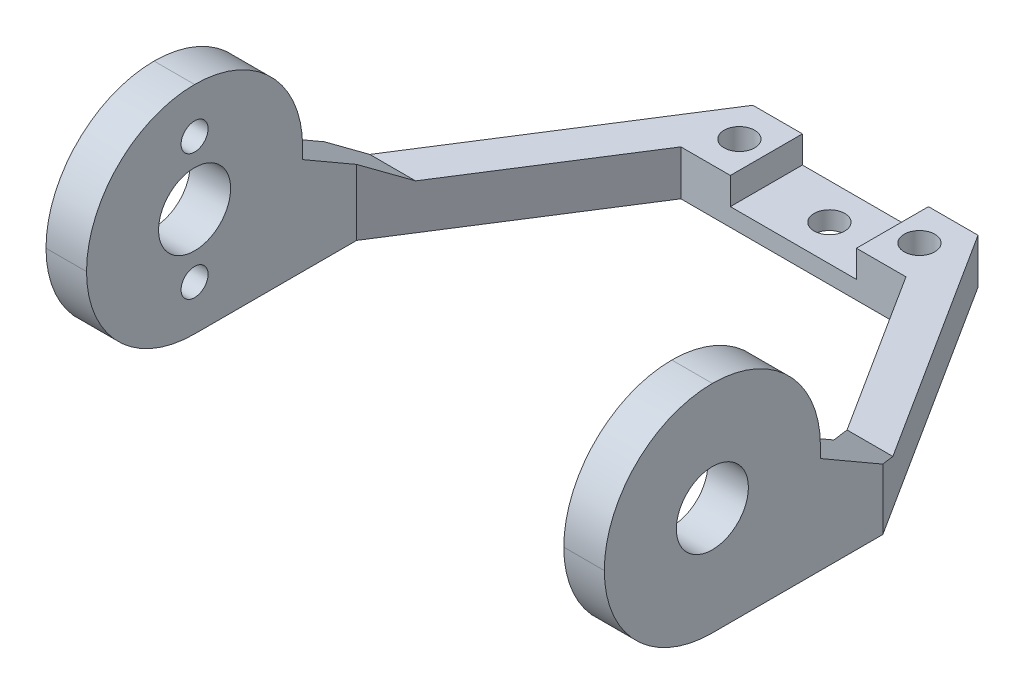
ISO-10303-21;
HEADER;
FILE_DESCRIPTION(('STEP AP214'),'2;1');
FILE_NAME('part.step','',(''),(''),'','','');
FILE_SCHEMA(('AUTOMOTIVE_DESIGN { 1 0 10303 214 1 1 1 1 }'));
ENDSEC;
DATA;
#1=APPLICATION_CONTEXT('core data for automotive mechanical design processes');
#2=APPLICATION_PROTOCOL_DEFINITION('international standard','automotive_design',2000,#1);
#3=PRODUCT_CONTEXT('',#1,'mechanical');
#4=PRODUCT('Part','Part','',(#3));
#5=PRODUCT_RELATED_PRODUCT_CATEGORY('part','',(#4));
#6=PRODUCT_DEFINITION_FORMATION('','',#4);
#7=PRODUCT_DEFINITION_CONTEXT('part definition',#1,'design');
#8=PRODUCT_DEFINITION('design','',#6,#7);
#9=PRODUCT_DEFINITION_SHAPE('','',#8);
#10=(LENGTH_UNIT() NAMED_UNIT(*) SI_UNIT(.MILLI.,.METRE.));
#11=(NAMED_UNIT(*) PLANE_ANGLE_UNIT() SI_UNIT($,.RADIAN.));
#12=(NAMED_UNIT(*) SI_UNIT($,.STERADIAN.) SOLID_ANGLE_UNIT());
#13=UNCERTAINTY_MEASURE_WITH_UNIT(LENGTH_MEASURE(1.E-05),#10,'distance_accuracy_value','');
#14=(GEOMETRIC_REPRESENTATION_CONTEXT(3) GLOBAL_UNCERTAINTY_ASSIGNED_CONTEXT((#13)) GLOBAL_UNIT_ASSIGNED_CONTEXT((#10,
#11,#12)) REPRESENTATION_CONTEXT('',''));
#15=CARTESIAN_POINT('',(0.,0.,0.));
#16=DIRECTION('',(0.,0.,1.));
#17=DIRECTION('',(1.,0.,0.));
#18=AXIS2_PLACEMENT_3D('',#15,#16,#17);
#19=CARTESIAN_POINT('',(0.,5.,0.));
#20=DIRECTION('',(0.,-1.,0.));
#21=DIRECTION('',(0.,0.,-1.));
#22=AXIS2_PLACEMENT_3D('',#19,#20,#21);
#23=PLANE('',#22);
#24=DIRECTION('',(0.536875492193159,0.,0.843661487732107));
#25=VECTOR('',#24,1.);
#26=CARTESIAN_POINT('',(12.5,5.,-37.));
#27=LINE('',#26,#25);
#28=CARTESIAN_POINT('',(12.5,5.,-37.));
#29=VERTEX_POINT('',#28);
#30=CARTESIAN_POINT('',(23.9545454545455,5.,-18.9999999999999));
#31=VERTEX_POINT('',#30);
#32=EDGE_CURVE('E227',#29,#31,#27,.T.);
#33=ORIENTED_EDGE('',*,*,#32,.T.);
#34=DIRECTION('',(1.,0.,0.));
#35=VECTOR('',#34,1.);
#36=CARTESIAN_POINT('',(31.,5.,-18.9999999999999));
#37=LINE('',#36,#35);
#38=CARTESIAN_POINT('',(29.0454545454546,5.,-18.9999999999999));
#39=VERTEX_POINT('',#38);
#40=EDGE_CURVE('E342',#31,#39,#37,.T.);
#41=ORIENTED_EDGE('',*,*,#40,.T.);
#42=DIRECTION('',(-0.536875492193159,0.,-0.843661487732108));
#43=VECTOR('',#42,1.);
#44=CARTESIAN_POINT('',(12.5,5.,-45.));
#45=LINE('',#44,#43);
#46=CARTESIAN_POINT('',(12.5,5.,-45.));
#47=VERTEX_POINT('',#46);
#48=EDGE_CURVE('E224',#39,#47,#45,.T.);
#49=ORIENTED_EDGE('',*,*,#48,.T.);
#50=DIRECTION('',(-1.,0.,0.));
#51=VECTOR('',#50,1.);
#52=CARTESIAN_POINT('',(-12.5,5.,-45.));
#53=LINE('',#52,#51);
#54=CARTESIAN_POINT('',(7.,5.,-45.));
#55=VERTEX_POINT('',#54);
#56=EDGE_CURVE('E223',#47,#55,#53,.T.);
#57=ORIENTED_EDGE('',*,*,#56,.T.);
#58=DIRECTION('',(0.,0.,-1.));
#59=VECTOR('',#58,1.);
#60=CARTESIAN_POINT('',(7.,5.,-22.6821789367236));
#61=LINE('',#60,#59);
#62=CARTESIAN_POINT('',(7.,5.,-37.));
#63=VERTEX_POINT('',#62);
#64=EDGE_CURVE('E216',#63,#55,#61,.T.);
#65=ORIENTED_EDGE('',*,*,#64,.F.);
#66=DIRECTION('',(1.,0.,0.));
#67=VECTOR('',#66,1.);
#68=CARTESIAN_POINT('',(-12.5,5.,-37.));
#69=LINE('',#68,#67);
#70=EDGE_CURVE('E384',#63,#29,#69,.T.);
#71=ORIENTED_EDGE('',*,*,#70,.T.);
#72=EDGE_LOOP('',(#33,#41,#49,#57,#65,#71));
#73=FACE_BOUND('',#72,.T.);
#74=CARTESIAN_POINT('',(10.,5.,-41.));
#75=DIRECTION('',(0.,-1.,0.));
#76=DIRECTION('',(0.,0.,1.));
#77=AXIS2_PLACEMENT_3D('',#74,#75,#76);
#78=CIRCLE('',#77,1.7);
#79=CARTESIAN_POINT('',(10.,5.,-39.3));
#80=VERTEX_POINT('',#79);
#81=EDGE_CURVE('E831',#80,#80,#78,.T.);
#82=ORIENTED_EDGE('',*,*,#81,.T.);
#83=EDGE_LOOP('',(#82));
#84=FACE_BOUND('',#83,.T.);
#85=ADVANCED_FACE('F35',(#73,#84),#23,.F.);
#86=CARTESIAN_POINT('',(0.,0.,0.));
#87=DIRECTION('',(0.,-1.,0.));
#88=DIRECTION('',(0.,0.,-1.));
#89=AXIS2_PLACEMENT_3D('',#86,#87,#88);
#90=PLANE('',#89);
#91=DIRECTION('',(0.,0.,-1.));
#92=VECTOR('',#91,1.);
#93=CARTESIAN_POINT('',(31.,0.,15.));
#94=LINE('',#93,#92);
#95=CARTESIAN_POINT('',(31.,0.,3.));
#96=VERTEX_POINT('',#95);
#97=CARTESIAN_POINT('',(31.,0.,-15.9285714285714));
#98=VERTEX_POINT('',#97);
#99=EDGE_CURVE('E249',#96,#98,#94,.T.);
#100=ORIENTED_EDGE('',*,*,#99,.F.);
#101=DIRECTION('',(1.,0.,0.));
#102=VECTOR('',#101,1.);
#103=CARTESIAN_POINT('',(26.5,0.,3.));
#104=LINE('',#103,#102);
#105=CARTESIAN_POINT('',(26.5,0.,3.));
#106=VERTEX_POINT('',#105);
#107=EDGE_CURVE('E318',#96,#106,#104,.F.);
#108=ORIENTED_EDGE('',*,*,#107,.T.);
#109=DIRECTION('',(0.,0.,1.));
#110=VECTOR('',#109,1.);
#111=CARTESIAN_POINT('',(26.5,0.,15.));
#112=LINE('',#111,#110);
#113=CARTESIAN_POINT('',(26.5,0.,-15.));
#114=VERTEX_POINT('',#113);
#115=EDGE_CURVE('E246',#114,#106,#112,.T.);
#116=ORIENTED_EDGE('',*,*,#115,.F.);
#117=DIRECTION('',(0.536875492193159,0.,0.843661487732107));
#118=VECTOR('',#117,1.);
#119=CARTESIAN_POINT('',(12.5,0.,-37.));
#120=LINE('',#119,#118);
#121=CARTESIAN_POINT('',(12.5,0.,-37.));
#122=VERTEX_POINT('',#121);
#123=EDGE_CURVE('E244',#122,#114,#120,.T.);
#124=ORIENTED_EDGE('',*,*,#123,.F.);
#125=DIRECTION('',(1.,0.,0.));
#126=VECTOR('',#125,1.);
#127=CARTESIAN_POINT('',(-12.5,0.,-37.));
#128=LINE('',#127,#126);
#129=CARTESIAN_POINT('',(-12.5,0.,-37.));
#130=VERTEX_POINT('',#129);
#131=EDGE_CURVE('E242',#130,#122,#128,.T.);
#132=ORIENTED_EDGE('',*,*,#131,.F.);
#133=DIRECTION('',(0.536875492193159,0.,-0.843661487732108));
#134=VECTOR('',#133,1.);
#135=CARTESIAN_POINT('',(-26.5,0.,-15.));
#136=LINE('',#135,#134);
#137=CARTESIAN_POINT('',(-26.5,0.,-15.));
#138=VERTEX_POINT('',#137);
#139=EDGE_CURVE('E240',#138,#130,#136,.T.);
#140=ORIENTED_EDGE('',*,*,#139,.F.);
#141=DIRECTION('',(0.,0.,-1.));
#142=VECTOR('',#141,1.);
#143=CARTESIAN_POINT('',(-26.5,0.,15.));
#144=LINE('',#143,#142);
#145=CARTESIAN_POINT('',(-26.5,0.,3.));
#146=VERTEX_POINT('',#145);
#147=EDGE_CURVE('E238',#146,#138,#144,.T.);
#148=ORIENTED_EDGE('',*,*,#147,.F.);
#149=DIRECTION('',(1.,0.,0.));
#150=VECTOR('',#149,1.);
#151=CARTESIAN_POINT('',(-31.,0.,3.));
#152=LINE('',#151,#150);
#153=CARTESIAN_POINT('',(-31.,0.,3.));
#154=VERTEX_POINT('',#153);
#155=EDGE_CURVE('E316',#146,#154,#152,.F.);
#156=ORIENTED_EDGE('',*,*,#155,.T.);
#157=DIRECTION('',(0.,0.,1.));
#158=VECTOR('',#157,1.);
#159=CARTESIAN_POINT('',(-31.,0.,-15.9285714285714));
#160=LINE('',#159,#158);
#161=CARTESIAN_POINT('',(-31.,0.,-15.9285714285714));
#162=VERTEX_POINT('',#161);
#163=EDGE_CURVE('E234',#162,#154,#160,.T.);
#164=ORIENTED_EDGE('',*,*,#163,.F.);
#165=DIRECTION('',(-0.536875492193159,0.,0.843661487732108));
#166=VECTOR('',#165,1.);
#167=CARTESIAN_POINT('',(-31.,0.,-15.9285714285714));
#168=LINE('',#167,#166);
#169=CARTESIAN_POINT('',(-12.5,0.,-45.));
#170=VERTEX_POINT('',#169);
#171=EDGE_CURVE('E231',#170,#162,#168,.T.);
#172=ORIENTED_EDGE('',*,*,#171,.F.);
#173=DIRECTION('',(-1.,0.,0.));
#174=VECTOR('',#173,1.);
#175=CARTESIAN_POINT('',(-12.5,0.,-45.));
#176=LINE('',#175,#174);
#177=CARTESIAN_POINT('',(12.5,0.,-45.));
#178=VERTEX_POINT('',#177);
#179=EDGE_CURVE('E253',#178,#170,#176,.T.);
#180=ORIENTED_EDGE('',*,*,#179,.F.);
#181=DIRECTION('',(-0.536875492193159,0.,-0.843661487732108));
#182=VECTOR('',#181,1.);
#183=CARTESIAN_POINT('',(12.5,0.,-45.));
#184=LINE('',#183,#182);
#185=EDGE_CURVE('E251',#98,#178,#184,.T.);
#186=ORIENTED_EDGE('',*,*,#185,.F.);
#187=EDGE_LOOP('',(#100,#108,#116,#124,#132,#140,#148,#156,#164,#172,#180,#186));
#188=FACE_BOUND('',#187,.T.);
#189=CARTESIAN_POINT('',(0.,0.,-41.));
#190=DIRECTION('',(0.,-1.,0.));
#191=DIRECTION('',(0.,0.,-1.));
#192=AXIS2_PLACEMENT_3D('',#189,#190,#191);
#193=CIRCLE('',#192,1.7);
#194=CARTESIAN_POINT('',(0.,0.,-42.7));
#195=VERTEX_POINT('',#194);
#196=EDGE_CURVE('E377',#195,#195,#193,.F.);
#197=ORIENTED_EDGE('',*,*,#196,.T.);
#198=EDGE_LOOP('',(#197));
#199=FACE_BOUND('',#198,.T.);
#200=CARTESIAN_POINT('',(-10.,0.,-41.));
#201=DIRECTION('',(0.,-1.,0.));
#202=DIRECTION('',(0.,0.,-1.));
#203=AXIS2_PLACEMENT_3D('',#200,#201,#202);
#204=CIRCLE('',#203,1.7);
#205=CARTESIAN_POINT('',(-10.,0.,-42.7));
#206=VERTEX_POINT('',#205);
#207=EDGE_CURVE('E429',#206,#206,#204,.F.);
#208=ORIENTED_EDGE('',*,*,#207,.T.);
#209=EDGE_LOOP('',(#208));
#210=FACE_BOUND('',#209,.T.);
#211=CARTESIAN_POINT('',(10.,0.,-41.));
#212=DIRECTION('',(0.,-1.,0.));
#213=DIRECTION('',(0.,0.,-1.));
#214=AXIS2_PLACEMENT_3D('',#211,#212,#213);
#215=CIRCLE('',#214,1.7);
#216=CARTESIAN_POINT('',(10.,0.,-42.7));
#217=VERTEX_POINT('',#216);
#218=EDGE_CURVE('E432',#217,#217,#215,.T.);
#219=ORIENTED_EDGE('',*,*,#218,.F.);
#220=EDGE_LOOP('',(#219));
#221=FACE_BOUND('',#220,.T.);
#222=ADVANCED_FACE('F409',(#188,#199,#210,#221),#90,.T.);
#223=CARTESIAN_POINT('',(-10.,5.,-41.));
#224=DIRECTION('',(0.,1.,0.));
#225=DIRECTION('',(0.,0.,1.));
#226=AXIS2_PLACEMENT_3D('',#223,#224,#225);
#227=CIRCLE('',#226,1.7);
#228=CARTESIAN_POINT('',(-10.,5.,-39.3));
#229=VERTEX_POINT('',#228);
#230=EDGE_CURVE('E332',#229,#229,#227,.T.);
#231=ORIENTED_EDGE('',*,*,#230,.F.);
#232=EDGE_LOOP('',(#231));
#233=FACE_BOUND('',#232,.T.);
#234=DIRECTION('',(-0.536875492193159,0.,0.843661487732108));
#235=VECTOR('',#234,1.);
#236=CARTESIAN_POINT('',(-31.,5.,-15.9285714285714));
#237=LINE('',#236,#235);
#238=CARTESIAN_POINT('',(-12.5,5.,-45.));
#239=VERTEX_POINT('',#238);
#240=CARTESIAN_POINT('',(-29.0454545454546,5.,-18.9999999999999));
#241=VERTEX_POINT('',#240);
#242=EDGE_CURVE('E255',#239,#241,#237,.T.);
#243=ORIENTED_EDGE('',*,*,#242,.T.);
#244=DIRECTION('',(1.,0.,0.));
#245=VECTOR('',#244,1.);
#246=CARTESIAN_POINT('',(-26.5,5.,-18.9999999999999));
#247=LINE('',#246,#245);
#248=CARTESIAN_POINT('',(-23.9545454545455,5.,-18.9999999999999));
#249=VERTEX_POINT('',#248);
#250=EDGE_CURVE('E337',#241,#249,#247,.T.);
#251=ORIENTED_EDGE('',*,*,#250,.T.);
#252=DIRECTION('',(0.536875492193159,0.,-0.843661487732108));
#253=VECTOR('',#252,1.);
#254=CARTESIAN_POINT('',(-26.5,5.,-15.));
#255=LINE('',#254,#253);
#256=CARTESIAN_POINT('',(-12.5,5.,-37.));
#257=VERTEX_POINT('',#256);
#258=EDGE_CURVE('E382',#249,#257,#255,.T.);
#259=ORIENTED_EDGE('',*,*,#258,.T.);
#260=CARTESIAN_POINT('',(-7.,5.,-37.));
#261=VERTEX_POINT('',#260);
#262=EDGE_CURVE('E215',#257,#261,#69,.T.);
#263=ORIENTED_EDGE('',*,*,#262,.T.);
#264=DIRECTION('',(0.,0.,-1.));
#265=VECTOR('',#264,1.);
#266=CARTESIAN_POINT('',(-7.,5.,-22.6821789367236));
#267=LINE('',#266,#265);
#268=CARTESIAN_POINT('',(-7.,5.,-45.));
#269=VERTEX_POINT('',#268);
#270=EDGE_CURVE('E197',#261,#269,#267,.T.);
#271=ORIENTED_EDGE('',*,*,#270,.T.);
#272=EDGE_CURVE('E212',#269,#239,#53,.T.);
#273=ORIENTED_EDGE('',*,*,#272,.T.);
#274=EDGE_LOOP('',(#243,#251,#259,#263,#271,#273));
#275=FACE_BOUND('',#274,.T.);
#276=ADVANCED_FACE('F211',(#233,#275),#23,.F.);
#277=CARTESIAN_POINT('',(-31.,5.,-15.9285714285714));
#278=DIRECTION('',(0.843661487732108,0.,0.536875492193159));
#279=DIRECTION('',(0.536875492193159,0.,-0.843661487732108));
#280=AXIS2_PLACEMENT_3D('',#277,#278,#279);
#281=PLANE('',#280);
#282=ORIENTED_EDGE('',*,*,#171,.T.);
#283=DIRECTION('',(0.,-1.,0.));
#284=VECTOR('',#283,1.);
#285=CARTESIAN_POINT('',(-31.,5.,-15.9285714285714));
#286=LINE('',#285,#284);
#287=CARTESIAN_POINT('',(-31.,6.77329011251099,-15.9285714285714));
#288=VERTEX_POINT('',#287);
#289=EDGE_CURVE('E271',#288,#162,#286,.T.);
#290=ORIENTED_EDGE('',*,*,#289,.F.);
#291=DIRECTION('',(-0.482662977574166,0.437903085761922,0.758470393330832));
#292=VECTOR('',#291,1.);
#293=CARTESIAN_POINT('',(-30.6251980982567,6.43324557429572,-16.5175458455965));
#294=LINE('',#293,#292);
#295=EDGE_CURVE('E347',#288,#241,#294,.F.);
#296=ORIENTED_EDGE('',*,*,#295,.T.);
#297=ORIENTED_EDGE('',*,*,#242,.F.);
#298=DIRECTION('',(0.,-1.,0.));
#299=VECTOR('',#298,1.);
#300=CARTESIAN_POINT('',(-12.5,5.,-45.));
#301=LINE('',#300,#299);
#302=EDGE_CURVE('E221',#239,#170,#301,.T.);
#303=ORIENTED_EDGE('',*,*,#302,.T.);
#304=EDGE_LOOP('',(#282,#290,#296,#297,#303));
#305=FACE_BOUND('',#304,.T.);
#306=ADVANCED_FACE('F418',(#305),#281,.F.);
#307=CARTESIAN_POINT('',(-31.,5.,-15.9285714285714));
#308=DIRECTION('',(1.,0.,0.));
#309=DIRECTION('',(0.,0.,-1.));
#310=AXIS2_PLACEMENT_3D('',#307,#308,#309);
#311=PLANE('',#310);
#312=CARTESIAN_POINT('',(-31.,12.,2.99999999999981));
#313=DIRECTION('',(1.,0.,0.));
#314=DIRECTION('',(0.,0.,-1.));
#315=AXIS2_PLACEMENT_3D('',#312,#313,#314);
#316=CIRCLE('',#315,4.);
#317=CARTESIAN_POINT('',(-31.,12.,-1.00000000000019));
#318=VERTEX_POINT('',#317);
#319=EDGE_CURVE('E445',#318,#318,#316,.T.);
#320=ORIENTED_EDGE('',*,*,#319,.T.);
#321=EDGE_LOOP('',(#320));
#322=FACE_BOUND('',#321,.T.);
#323=CARTESIAN_POINT('',(-31.,5.,2.99999999999961));
#324=DIRECTION('',(1.,0.,0.));
#325=DIRECTION('',(0.,0.,-1.));
#326=AXIS2_PLACEMENT_3D('',#323,#324,#325);
#327=CIRCLE('',#326,1.50000000000043);
#328=CARTESIAN_POINT('',(-31.,5.,1.49999999999918));
#329=VERTEX_POINT('',#328);
#330=EDGE_CURVE('E451',#329,#329,#327,.F.);
#331=ORIENTED_EDGE('',*,*,#330,.F.);
#332=EDGE_LOOP('',(#331));
#333=FACE_BOUND('',#332,.T.);
#334=CARTESIAN_POINT('',(-31.,19.,3.00000000000001));
#335=DIRECTION('',(1.,0.,0.));
#336=DIRECTION('',(0.,0.,-1.));
#337=AXIS2_PLACEMENT_3D('',#334,#335,#336);
#338=CIRCLE('',#337,1.5);
#339=CARTESIAN_POINT('',(-31.,19.,1.50000000000001));
#340=VERTEX_POINT('',#339);
#341=EDGE_CURVE('E206',#340,#340,#338,.F.);
#342=ORIENTED_EDGE('',*,*,#341,.F.);
#343=EDGE_LOOP('',(#342));
#344=FACE_BOUND('',#343,.T.);
#345=CARTESIAN_POINT('',(-31.,12.,3.));
#346=DIRECTION('',(1.,0.,0.));
#347=DIRECTION('',(0.,0.,-1.));
#348=AXIS2_PLACEMENT_3D('',#345,#346,#347);
#349=CIRCLE('',#348,12.);
#350=CARTESIAN_POINT('',(-31.,12.,15.));
#351=VERTEX_POINT('',#350);
#352=CARTESIAN_POINT('',(-31.,24.,3.));
#353=VERTEX_POINT('',#352);
#354=EDGE_CURVE('E286',#351,#353,#349,.F.);
#355=ORIENTED_EDGE('',*,*,#354,.T.);
#356=CARTESIAN_POINT('',(-31.,12.,3.));
#357=DIRECTION('',(1.,0.,0.));
#358=DIRECTION('',(0.,0.,-1.));
#359=AXIS2_PLACEMENT_3D('',#356,#357,#358);
#360=CIRCLE('',#359,12.);
#361=CARTESIAN_POINT('',(-31.,12.,-9.));
#362=VERTEX_POINT('',#361);
#363=EDGE_CURVE('E288',#353,#362,#360,.F.);
#364=ORIENTED_EDGE('',*,*,#363,.T.);
#365=DIRECTION('',(0.,-1.,0.));
#366=VECTOR('',#365,1.);
#367=CARTESIAN_POINT('',(-31.,24.,-9.));
#368=LINE('',#367,#366);
#369=CARTESIAN_POINT('',(-31.,10.7735026918963,-9.));
#370=VERTEX_POINT('',#369);
#371=EDGE_CURVE('E280',#362,#370,#368,.T.);
#372=ORIENTED_EDGE('',*,*,#371,.T.);
#373=DIRECTION('',(0.,0.500000000000005,0.866025403784436));
#374=VECTOR('',#373,1.);
#375=CARTESIAN_POINT('',(-31.,6.32996758438323,-16.6964285714286));
#376=LINE('',#375,#374);
#377=EDGE_CURVE('E344',#370,#288,#376,.F.);
#378=ORIENTED_EDGE('',*,*,#377,.T.);
#379=ORIENTED_EDGE('',*,*,#289,.T.);
#380=ORIENTED_EDGE('',*,*,#163,.T.);
#381=CARTESIAN_POINT('',(-31.,12.,3.));
#382=DIRECTION('',(1.,0.,0.));
#383=DIRECTION('',(0.,0.,-1.));
#384=AXIS2_PLACEMENT_3D('',#381,#382,#383);
#385=CIRCLE('',#384,12.);
#386=EDGE_CURVE('E274',#154,#351,#385,.F.);
#387=ORIENTED_EDGE('',*,*,#386,.T.);
#388=EDGE_LOOP('',(#355,#364,#372,#378,#379,#380,#387));
#389=FACE_BOUND('',#388,.T.);
#390=ADVANCED_FACE('F423',(#322,#333,#344,#389),#311,.F.);
#391=CARTESIAN_POINT('',(-26.5,5.,15.));
#392=DIRECTION('',(-1.,0.,0.));
#393=DIRECTION('',(0.,0.,1.));
#394=AXIS2_PLACEMENT_3D('',#391,#392,#393);
#395=PLANE('',#394);
#396=CARTESIAN_POINT('',(-26.5,12.,2.99999999999981));
#397=DIRECTION('',(-1.,0.,0.));
#398=DIRECTION('',(0.,0.,1.));
#399=AXIS2_PLACEMENT_3D('',#396,#397,#398);
#400=CIRCLE('',#399,4.);
#401=CARTESIAN_POINT('',(-26.5,12.,6.99999999999981));
#402=VERTEX_POINT('',#401);
#403=EDGE_CURVE('E442',#402,#402,#400,.T.);
#404=ORIENTED_EDGE('',*,*,#403,.T.);
#405=EDGE_LOOP('',(#404));
#406=FACE_BOUND('',#405,.T.);
#407=CARTESIAN_POINT('',(-26.5,5.,2.99999999999961));
#408=DIRECTION('',(1.,0.,0.));
#409=DIRECTION('',(0.,0.,-1.));
#410=AXIS2_PLACEMENT_3D('',#407,#408,#409);
#411=CIRCLE('',#410,1.50000000000043);
#412=CARTESIAN_POINT('',(-26.5,5.,1.49999999999918));
#413=VERTEX_POINT('',#412);
#414=EDGE_CURVE('E448',#413,#413,#411,.T.);
#415=ORIENTED_EDGE('',*,*,#414,.F.);
#416=EDGE_LOOP('',(#415));
#417=FACE_BOUND('',#416,.T.);
#418=CARTESIAN_POINT('',(-26.5,19.,3.00000000000001));
#419=DIRECTION('',(1.,0.,0.));
#420=DIRECTION('',(0.,0.,-1.));
#421=AXIS2_PLACEMENT_3D('',#418,#419,#420);
#422=CIRCLE('',#421,1.5);
#423=CARTESIAN_POINT('',(-26.5,19.,1.50000000000001));
#424=VERTEX_POINT('',#423);
#425=EDGE_CURVE('E454',#424,#424,#422,.T.);
#426=ORIENTED_EDGE('',*,*,#425,.F.);
#427=EDGE_LOOP('',(#426));
#428=FACE_BOUND('',#427,.T.);
#429=DIRECTION('',(0.,-1.,0.));
#430=VECTOR('',#429,1.);
#431=CARTESIAN_POINT('',(-26.5,24.,-9.));
#432=LINE('',#431,#430);
#433=CARTESIAN_POINT('',(-26.5,12.,-9.));
#434=VERTEX_POINT('',#433);
#435=CARTESIAN_POINT('',(-26.5,10.7735026918963,-9.));
#436=VERTEX_POINT('',#435);
#437=EDGE_CURVE('E235',#434,#436,#432,.T.);
#438=ORIENTED_EDGE('',*,*,#437,.F.);
#439=CARTESIAN_POINT('',(-26.5,12.,3.));
#440=DIRECTION('',(-1.,0.,0.));
#441=DIRECTION('',(0.,0.,1.));
#442=AXIS2_PLACEMENT_3D('',#439,#440,#441);
#443=CIRCLE('',#442,12.);
#444=CARTESIAN_POINT('',(-26.5,24.,3.));
#445=VERTEX_POINT('',#444);
#446=EDGE_CURVE('E299',#434,#445,#443,.F.);
#447=ORIENTED_EDGE('',*,*,#446,.T.);
#448=CARTESIAN_POINT('',(-26.5,12.,3.));
#449=DIRECTION('',(-1.,0.,0.));
#450=DIRECTION('',(0.,0.,1.));
#451=AXIS2_PLACEMENT_3D('',#448,#449,#450);
#452=CIRCLE('',#451,12.);
#453=CARTESIAN_POINT('',(-26.5,12.,15.));
#454=VERTEX_POINT('',#453);
#455=EDGE_CURVE('E297',#445,#454,#452,.F.);
#456=ORIENTED_EDGE('',*,*,#455,.T.);
#457=CARTESIAN_POINT('',(-26.5,12.,3.));
#458=DIRECTION('',(-1.,0.,0.));
#459=DIRECTION('',(0.,0.,1.));
#460=AXIS2_PLACEMENT_3D('',#457,#458,#459);
#461=CIRCLE('',#460,12.);
#462=EDGE_CURVE('E295',#454,#146,#461,.F.);
#463=ORIENTED_EDGE('',*,*,#462,.T.);
#464=ORIENTED_EDGE('',*,*,#147,.T.);
#465=DIRECTION('',(0.,-1.,0.));
#466=VECTOR('',#465,1.);
#467=CARTESIAN_POINT('',(-26.5,5.,-15.));
#468=LINE('',#467,#466);
#469=CARTESIAN_POINT('',(-26.5,7.3094010767585,-15.));
#470=VERTEX_POINT('',#469);
#471=EDGE_CURVE('E268',#470,#138,#468,.T.);
#472=ORIENTED_EDGE('',*,*,#471,.F.);
#473=DIRECTION('',(0.,-0.500000000000005,-0.866025403784436));
#474=VECTOR('',#473,1.);
#475=CARTESIAN_POINT('',(-26.5,19.7224318643355,6.49999999999987));
#476=LINE('',#475,#474);
#477=EDGE_CURVE('E352',#470,#436,#476,.F.);
#478=ORIENTED_EDGE('',*,*,#477,.T.);
#479=EDGE_LOOP('',(#438,#447,#456,#463,#464,#472,#478));
#480=FACE_BOUND('',#479,.T.);
#481=ADVANCED_FACE('F523',(#406,#417,#428,#480),#395,.F.);
#482=CARTESIAN_POINT('',(-26.5,5.,-15.));
#483=DIRECTION('',(-0.843661487732108,0.,-0.536875492193159));
#484=DIRECTION('',(-0.536875492193159,0.,0.843661487732108));
#485=AXIS2_PLACEMENT_3D('',#482,#483,#484);
#486=PLANE('',#485);
#487=ORIENTED_EDGE('',*,*,#139,.T.);
#488=DIRECTION('',(0.,-1.,0.));
#489=VECTOR('',#488,1.);
#490=CARTESIAN_POINT('',(-12.5,5.,-37.));
#491=LINE('',#490,#489);
#492=EDGE_CURVE('E265',#257,#130,#491,.T.);
#493=ORIENTED_EDGE('',*,*,#492,.F.);
#494=ORIENTED_EDGE('',*,*,#258,.F.);
#495=DIRECTION('',(0.482662977574166,-0.437903085761922,-0.758470393330832));
#496=VECTOR('',#495,1.);
#497=CARTESIAN_POINT('',(-26.0118858954041,6.86655237582699,-15.7670364500792));
#498=LINE('',#497,#496);
#499=EDGE_CURVE('E349',#249,#470,#498,.F.);
#500=ORIENTED_EDGE('',*,*,#499,.T.);
#501=ORIENTED_EDGE('',*,*,#471,.T.);
#502=EDGE_LOOP('',(#487,#493,#494,#500,#501));
#503=FACE_BOUND('',#502,.T.);
#504=ADVANCED_FACE('F405',(#503),#486,.F.);
#505=CARTESIAN_POINT('',(-12.5,5.,-37.));
#506=DIRECTION('',(0.,0.,-1.));
#507=DIRECTION('',(-1.,0.,0.));
#508=AXIS2_PLACEMENT_3D('',#505,#506,#507);
#509=PLANE('',#508);
#510=DIRECTION('',(1.,0.,0.));
#511=VECTOR('',#510,1.);
#512=CARTESIAN_POINT('',(7.,2.,-37.));
#513=LINE('',#512,#511);
#514=CARTESIAN_POINT('',(-7.,2.,-37.));
#515=VERTEX_POINT('',#514);
#516=CARTESIAN_POINT('',(7.,2.,-37.));
#517=VERTEX_POINT('',#516);
#518=EDGE_CURVE('E461',#515,#517,#513,.T.);
#519=ORIENTED_EDGE('',*,*,#518,.F.);
#520=DIRECTION('',(0.,-1.,0.));
#521=VECTOR('',#520,1.);
#522=CARTESIAN_POINT('',(-7.,2.,-37.));
#523=LINE('',#522,#521);
#524=EDGE_CURVE('E463',#261,#515,#523,.T.);
#525=ORIENTED_EDGE('',*,*,#524,.F.);
#526=ORIENTED_EDGE('',*,*,#262,.F.);
#527=ORIENTED_EDGE('',*,*,#492,.T.);
#528=ORIENTED_EDGE('',*,*,#131,.T.);
#529=DIRECTION('',(0.,-1.,0.));
#530=VECTOR('',#529,1.);
#531=CARTESIAN_POINT('',(12.5,5.,-37.));
#532=LINE('',#531,#530);
#533=EDGE_CURVE('E262',#29,#122,#532,.T.);
#534=ORIENTED_EDGE('',*,*,#533,.F.);
#535=ORIENTED_EDGE('',*,*,#70,.F.);
#536=DIRECTION('',(0.,1.,0.));
#537=VECTOR('',#536,1.);
#538=CARTESIAN_POINT('',(7.,2.,-37.));
#539=LINE('',#538,#537);
#540=EDGE_CURVE('E459',#517,#63,#539,.T.);
#541=ORIENTED_EDGE('',*,*,#540,.F.);
#542=EDGE_LOOP('',(#519,#525,#526,#527,#528,#534,#535,#541));
#543=FACE_BOUND('',#542,.T.);
#544=ADVANCED_FACE('F397',(#543),#509,.F.);
#545=CARTESIAN_POINT('',(12.5,5.,-37.));
#546=DIRECTION('',(0.843661487732107,0.,-0.536875492193159));
#547=DIRECTION('',(-0.536875492193159,0.,-0.843661487732107));
#548=AXIS2_PLACEMENT_3D('',#545,#546,#547);
#549=PLANE('',#548);
#550=ORIENTED_EDGE('',*,*,#123,.T.);
#551=DIRECTION('',(0.,-1.,0.));
#552=VECTOR('',#551,1.);
#553=CARTESIAN_POINT('',(26.5,5.,-15.));
#554=LINE('',#553,#552);
#555=CARTESIAN_POINT('',(26.5,7.30940107675849,-15.));
#556=VERTEX_POINT('',#555);
#557=EDGE_CURVE('E57',#556,#114,#554,.T.);
#558=ORIENTED_EDGE('',*,*,#557,.F.);
#559=DIRECTION('',(0.482662977574166,0.437903085761922,0.758470393330832));
#560=VECTOR('',#559,1.);
#561=CARTESIAN_POINT('',(14.6965134706815,-3.39948569122159,-33.5483359746433));
#562=LINE('',#561,#560);
#563=EDGE_CURVE('E356',#556,#31,#562,.F.);
#564=ORIENTED_EDGE('',*,*,#563,.T.);
#565=ORIENTED_EDGE('',*,*,#32,.F.);
#566=ORIENTED_EDGE('',*,*,#533,.T.);
#567=EDGE_LOOP('',(#550,#558,#564,#565,#566));
#568=FACE_BOUND('',#567,.T.);
#569=ADVANCED_FACE('F393',(#568),#549,.F.);
#570=CARTESIAN_POINT('',(26.5,5.,15.));
#571=DIRECTION('',(1.,0.,0.));
#572=DIRECTION('',(0.,0.,-1.));
#573=AXIS2_PLACEMENT_3D('',#570,#571,#572);
#574=PLANE('',#573);
#575=CARTESIAN_POINT('',(26.5,12.,2.99999999999981));
#576=DIRECTION('',(1.,0.,0.));
#577=DIRECTION('',(0.,0.,-1.));
#578=AXIS2_PLACEMENT_3D('',#575,#576,#577);
#579=CIRCLE('',#578,4.);
#580=CARTESIAN_POINT('',(26.5,12.,-1.00000000000019));
#581=VERTEX_POINT('',#580);
#582=EDGE_CURVE('E439',#581,#581,#579,.T.);
#583=ORIENTED_EDGE('',*,*,#582,.T.);
#584=EDGE_LOOP('',(#583));
#585=FACE_BOUND('',#584,.T.);
#586=CARTESIAN_POINT('',(26.5,12.,3.));
#587=DIRECTION('',(1.,0.,0.));
#588=DIRECTION('',(0.,0.,-1.));
#589=AXIS2_PLACEMENT_3D('',#586,#587,#588);
#590=CIRCLE('',#589,12.);
#591=CARTESIAN_POINT('',(26.5,12.,15.));
#592=VERTEX_POINT('',#591);
#593=CARTESIAN_POINT('',(26.5,24.,3.));
#594=VERTEX_POINT('',#593);
#595=EDGE_CURVE('E303',#592,#594,#590,.F.);
#596=ORIENTED_EDGE('',*,*,#595,.T.);
#597=CARTESIAN_POINT('',(26.5,12.,3.));
#598=DIRECTION('',(1.,0.,0.));
#599=DIRECTION('',(0.,0.,-1.));
#600=AXIS2_PLACEMENT_3D('',#597,#598,#599);
#601=CIRCLE('',#600,12.);
#602=CARTESIAN_POINT('',(26.5,12.,-9.));
#603=VERTEX_POINT('',#602);
#604=EDGE_CURVE('E305',#594,#603,#601,.F.);
#605=ORIENTED_EDGE('',*,*,#604,.T.);
#606=DIRECTION('',(0.,-1.,0.));
#607=VECTOR('',#606,1.);
#608=CARTESIAN_POINT('',(26.5,24.,-9.));
#609=LINE('',#608,#607);
#610=CARTESIAN_POINT('',(26.5,10.7735026918963,-9.));
#611=VERTEX_POINT('',#610);
#612=EDGE_CURVE('E375',#603,#611,#609,.T.);
#613=ORIENTED_EDGE('',*,*,#612,.T.);
#614=DIRECTION('',(0.,0.500000000000005,0.866025403784436));
#615=VECTOR('',#614,1.);
#616=CARTESIAN_POINT('',(26.5,19.7224318643355,6.49999999999987));
#617=LINE('',#616,#615);
#618=EDGE_CURVE('E354',#611,#556,#617,.F.);
#619=ORIENTED_EDGE('',*,*,#618,.T.);
#620=ORIENTED_EDGE('',*,*,#557,.T.);
#621=ORIENTED_EDGE('',*,*,#115,.T.);
#622=CARTESIAN_POINT('',(26.5,12.,3.));
#623=DIRECTION('',(1.,0.,0.));
#624=DIRECTION('',(0.,0.,-1.));
#625=AXIS2_PLACEMENT_3D('',#622,#623,#624);
#626=CIRCLE('',#625,12.);
#627=EDGE_CURVE('E301',#106,#592,#626,.F.);
#628=ORIENTED_EDGE('',*,*,#627,.T.);
#629=EDGE_LOOP('',(#596,#605,#613,#619,#620,#621,#628));
#630=FACE_BOUND('',#629,.T.);
#631=ADVANCED_FACE('F396',(#585,#630),#574,.F.);
#632=CARTESIAN_POINT('',(31.,5.,15.));
#633=DIRECTION('',(-1.,0.,0.));
#634=DIRECTION('',(0.,0.,1.));
#635=AXIS2_PLACEMENT_3D('',#632,#633,#634);
#636=PLANE('',#635);
#637=CARTESIAN_POINT('',(31.,12.,2.99999999999981));
#638=DIRECTION('',(1.,0.,0.));
#639=DIRECTION('',(0.,0.,-1.));
#640=AXIS2_PLACEMENT_3D('',#637,#638,#639);
#641=CIRCLE('',#640,4.);
#642=CARTESIAN_POINT('',(31.,12.,-1.00000000000019));
#643=VERTEX_POINT('',#642);
#644=EDGE_CURVE('E328',#643,#643,#641,.T.);
#645=ORIENTED_EDGE('',*,*,#644,.F.);
#646=EDGE_LOOP('',(#645));
#647=FACE_BOUND('',#646,.T.);
#648=DIRECTION('',(0.,-1.,0.));
#649=VECTOR('',#648,1.);
#650=CARTESIAN_POINT('',(31.,24.,-9.));
#651=LINE('',#650,#649);
#652=CARTESIAN_POINT('',(31.,12.,-9.));
#653=VERTEX_POINT('',#652);
#654=CARTESIAN_POINT('',(31.,10.7735026918963,-9.));
#655=VERTEX_POINT('',#654);
#656=EDGE_CURVE('E283',#653,#655,#651,.T.);
#657=ORIENTED_EDGE('',*,*,#656,.F.);
#658=CARTESIAN_POINT('',(31.,12.,3.));
#659=DIRECTION('',(-1.,0.,0.));
#660=DIRECTION('',(0.,0.,1.));
#661=AXIS2_PLACEMENT_3D('',#658,#659,#660);
#662=CIRCLE('',#661,12.);
#663=CARTESIAN_POINT('',(31.,24.,3.));
#664=VERTEX_POINT('',#663);
#665=EDGE_CURVE('E314',#653,#664,#662,.F.);
#666=ORIENTED_EDGE('',*,*,#665,.T.);
#667=CARTESIAN_POINT('',(31.,12.,3.));
#668=DIRECTION('',(-1.,0.,0.));
#669=DIRECTION('',(0.,0.,1.));
#670=AXIS2_PLACEMENT_3D('',#667,#668,#669);
#671=CIRCLE('',#670,12.);
#672=CARTESIAN_POINT('',(31.,12.,15.));
#673=VERTEX_POINT('',#672);
#674=EDGE_CURVE('E312',#664,#673,#671,.F.);
#675=ORIENTED_EDGE('',*,*,#674,.T.);
#676=CARTESIAN_POINT('',(31.,12.,3.));
#677=DIRECTION('',(-1.,0.,0.));
#678=DIRECTION('',(0.,0.,1.));
#679=AXIS2_PLACEMENT_3D('',#676,#677,#678);
#680=CIRCLE('',#679,12.);
#681=EDGE_CURVE('E310',#673,#96,#680,.F.);
#682=ORIENTED_EDGE('',*,*,#681,.T.);
#683=ORIENTED_EDGE('',*,*,#99,.T.);
#684=DIRECTION('',(0.,-1.,0.));
#685=VECTOR('',#684,1.);
#686=CARTESIAN_POINT('',(31.,5.,-15.9285714285714));
#687=LINE('',#686,#685);
#688=CARTESIAN_POINT('',(31.,6.77329011251098,-15.9285714285714));
#689=VERTEX_POINT('',#688);
#690=EDGE_CURVE('E49',#689,#98,#687,.T.);
#691=ORIENTED_EDGE('',*,*,#690,.F.);
#692=DIRECTION('',(0.,-0.500000000000005,-0.866025403784436));
#693=VECTOR('',#692,1.);
#694=CARTESIAN_POINT('',(31.,19.7224318643355,6.49999999999986));
#695=LINE('',#694,#693);
#696=EDGE_CURVE('E11',#689,#655,#695,.F.);
#697=ORIENTED_EDGE('',*,*,#696,.T.);
#698=EDGE_LOOP('',(#657,#666,#675,#682,#683,#691,#697));
#699=FACE_BOUND('',#698,.T.);
#700=ADVANCED_FACE('F369',(#647,#699),#636,.F.);
#701=CARTESIAN_POINT('',(12.5,5.,-45.));
#702=DIRECTION('',(-0.843661487732108,0.,0.536875492193159));
#703=DIRECTION('',(0.536875492193159,0.,0.843661487732108));
#704=AXIS2_PLACEMENT_3D('',#701,#702,#703);
#705=PLANE('',#704);
#706=ORIENTED_EDGE('',*,*,#185,.T.);
#707=DIRECTION('',(0.,-1.,0.));
#708=VECTOR('',#707,1.);
#709=CARTESIAN_POINT('',(12.5,5.,-45.));
#710=LINE('',#709,#708);
#711=EDGE_CURVE('E257',#47,#178,#710,.T.);
#712=ORIENTED_EDGE('',*,*,#711,.F.);
#713=ORIENTED_EDGE('',*,*,#48,.F.);
#714=DIRECTION('',(-0.482662977574166,-0.437903085761922,-0.758470393330832));
#715=VECTOR('',#714,1.);
#716=CARTESIAN_POINT('',(15.6727416798733,-7.13259044287562,-40.0142630744848));
#717=LINE('',#716,#715);
#718=EDGE_CURVE('E43',#39,#689,#717,.F.);
#719=ORIENTED_EDGE('',*,*,#718,.T.);
#720=ORIENTED_EDGE('',*,*,#690,.T.);
#721=EDGE_LOOP('',(#706,#712,#713,#719,#720));
#722=FACE_BOUND('',#721,.T.);
#723=ADVANCED_FACE('F361',(#722),#705,.F.);
#724=CARTESIAN_POINT('',(-12.5,5.,-45.));
#725=DIRECTION('',(0.,0.,1.));
#726=DIRECTION('',(1.,0.,0.));
#727=AXIS2_PLACEMENT_3D('',#724,#725,#726);
#728=PLANE('',#727);
#729=ORIENTED_EDGE('',*,*,#272,.F.);
#730=DIRECTION('',(0.,1.,0.));
#731=VECTOR('',#730,1.);
#732=CARTESIAN_POINT('',(-7.,2.,-45.));
#733=LINE('',#732,#731);
#734=CARTESIAN_POINT('',(-7.,2.,-45.));
#735=VERTEX_POINT('',#734);
#736=EDGE_CURVE('E194',#735,#269,#733,.T.);
#737=ORIENTED_EDGE('',*,*,#736,.F.);
#738=DIRECTION('',(-1.,0.,0.));
#739=VECTOR('',#738,1.);
#740=CARTESIAN_POINT('',(7.,2.,-45.));
#741=LINE('',#740,#739);
#742=CARTESIAN_POINT('',(7.,2.,-45.));
#743=VERTEX_POINT('',#742);
#744=EDGE_CURVE('E217',#743,#735,#741,.T.);
#745=ORIENTED_EDGE('',*,*,#744,.F.);
#746=DIRECTION('',(0.,-1.,0.));
#747=VECTOR('',#746,1.);
#748=CARTESIAN_POINT('',(7.,2.,-45.));
#749=LINE('',#748,#747);
#750=EDGE_CURVE('E205',#55,#743,#749,.T.);
#751=ORIENTED_EDGE('',*,*,#750,.F.);
#752=ORIENTED_EDGE('',*,*,#56,.F.);
#753=ORIENTED_EDGE('',*,*,#711,.T.);
#754=ORIENTED_EDGE('',*,*,#179,.T.);
#755=ORIENTED_EDGE('',*,*,#302,.F.);
#756=EDGE_LOOP('',(#729,#737,#745,#751,#752,#753,#754,#755));
#757=FACE_BOUND('',#756,.T.);
#758=ADVANCED_FACE('F219',(#757),#728,.F.);
#759=CARTESIAN_POINT('',(-26.5,24.,-9.));
#760=DIRECTION('',(0.,0.,1.));
#761=DIRECTION('',(1.,0.,0.));
#762=AXIS2_PLACEMENT_3D('',#759,#760,#761);
#763=PLANE('',#762);
#764=ORIENTED_EDGE('',*,*,#437,.T.);
#765=DIRECTION('',(-1.,0.,0.));
#766=VECTOR('',#765,1.);
#767=CARTESIAN_POINT('',(-31.,10.7735026918963,-9.));
#768=LINE('',#767,#766);
#769=EDGE_CURVE('E320',#436,#370,#768,.T.);
#770=ORIENTED_EDGE('',*,*,#769,.T.);
#771=ORIENTED_EDGE('',*,*,#371,.F.);
#772=DIRECTION('',(-1.,0.,0.));
#773=VECTOR('',#772,1.);
#774=CARTESIAN_POINT('',(-26.5,12.,-9.));
#775=LINE('',#774,#773);
#776=EDGE_CURVE('E290',#362,#434,#775,.F.);
#777=ORIENTED_EDGE('',*,*,#776,.T.);
#778=EDGE_LOOP('',(#764,#770,#771,#777));
#779=FACE_BOUND('',#778,.T.);
#780=ADVANCED_FACE('F499',(#779),#763,.F.);
#781=CARTESIAN_POINT('',(26.5,24.,-9.));
#782=DIRECTION('',(0.,0.,1.));
#783=DIRECTION('',(1.,0.,0.));
#784=AXIS2_PLACEMENT_3D('',#781,#782,#783);
#785=PLANE('',#784);
#786=ORIENTED_EDGE('',*,*,#656,.T.);
#787=DIRECTION('',(-1.,0.,0.));
#788=VECTOR('',#787,1.);
#789=CARTESIAN_POINT('',(26.5,10.7735026918963,-9.));
#790=LINE('',#789,#788);
#791=EDGE_CURVE('E339',#655,#611,#790,.T.);
#792=ORIENTED_EDGE('',*,*,#791,.T.);
#793=ORIENTED_EDGE('',*,*,#612,.F.);
#794=DIRECTION('',(-1.,0.,0.));
#795=VECTOR('',#794,1.);
#796=CARTESIAN_POINT('',(26.5,12.,-9.));
#797=LINE('',#796,#795);
#798=EDGE_CURVE('E307',#603,#653,#797,.F.);
#799=ORIENTED_EDGE('',*,*,#798,.T.);
#800=EDGE_LOOP('',(#786,#792,#793,#799));
#801=FACE_BOUND('',#800,.T.);
#802=ADVANCED_FACE('F371',(#801),#785,.F.);
#803=CARTESIAN_POINT('',(0.,-0.00100000000000013,-41.));
#804=DIRECTION('',(0.,1.,0.));
#805=DIRECTION('',(0.,0.,1.));
#806=AXIS2_PLACEMENT_3D('',#803,#804,#805);
#807=CYLINDRICAL_SURFACE('',#806,1.7);
#808=CARTESIAN_POINT('',(0.,2.,-41.));
#809=DIRECTION('',(0.,-1.,0.));
#810=DIRECTION('',(0.,0.,-1.));
#811=AXIS2_PLACEMENT_3D('',#808,#809,#810);
#812=CIRCLE('',#811,1.7);
#813=CARTESIAN_POINT('',(0.,2.,-42.7));
#814=VERTEX_POINT('',#813);
#815=EDGE_CURVE('E284',#814,#814,#812,.F.);
#816=ORIENTED_EDGE('',*,*,#815,.T.);
#817=EDGE_LOOP('',(#816));
#818=FACE_BOUND('',#817,.T.);
#819=ORIENTED_EDGE('',*,*,#196,.F.);
#820=EDGE_LOOP('',(#819));
#821=FACE_BOUND('',#820,.T.);
#822=ADVANCED_FACE('F477',(#818,#821),#807,.F.);
#823=CARTESIAN_POINT('',(7.,2.,-22.6821789367236));
#824=DIRECTION('',(0.,-1.,0.));
#825=DIRECTION('',(0.,0.,-1.));
#826=AXIS2_PLACEMENT_3D('',#823,#824,#825);
#827=PLANE('',#826);
#828=ORIENTED_EDGE('',*,*,#518,.T.);
#829=DIRECTION('',(0.,0.,-1.));
#830=VECTOR('',#829,1.);
#831=CARTESIAN_POINT('',(7.,2.,-22.6821789367236));
#832=LINE('',#831,#830);
#833=EDGE_CURVE('E469',#517,#743,#832,.T.);
#834=ORIENTED_EDGE('',*,*,#833,.T.);
#835=ORIENTED_EDGE('',*,*,#744,.T.);
#836=DIRECTION('',(0.,0.,-1.));
#837=VECTOR('',#836,1.);
#838=CARTESIAN_POINT('',(-7.,2.,-22.6821789367236));
#839=LINE('',#838,#837);
#840=EDGE_CURVE('E200',#515,#735,#839,.T.);
#841=ORIENTED_EDGE('',*,*,#840,.F.);
#842=EDGE_LOOP('',(#828,#834,#835,#841));
#843=FACE_BOUND('',#842,.T.);
#844=ORIENTED_EDGE('',*,*,#815,.F.);
#845=EDGE_LOOP('',(#844));
#846=FACE_BOUND('',#845,.T.);
#847=ADVANCED_FACE('F480',(#843,#846),#827,.F.);
#848=CARTESIAN_POINT('',(-7.,2.,-22.6821789367236));
#849=DIRECTION('',(-1.,0.,0.));
#850=DIRECTION('',(0.,0.,1.));
#851=AXIS2_PLACEMENT_3D('',#848,#849,#850);
#852=PLANE('',#851);
#853=ORIENTED_EDGE('',*,*,#524,.T.);
#854=ORIENTED_EDGE('',*,*,#840,.T.);
#855=ORIENTED_EDGE('',*,*,#736,.T.);
#856=ORIENTED_EDGE('',*,*,#270,.F.);
#857=EDGE_LOOP('',(#853,#854,#855,#856));
#858=FACE_BOUND('',#857,.T.);
#859=ADVANCED_FACE('F196',(#858),#852,.F.);
#860=CARTESIAN_POINT('',(7.,2.,-22.6821789367236));
#861=DIRECTION('',(1.,0.,0.));
#862=DIRECTION('',(0.,0.,-1.));
#863=AXIS2_PLACEMENT_3D('',#860,#861,#862);
#864=PLANE('',#863);
#865=ORIENTED_EDGE('',*,*,#540,.T.);
#866=ORIENTED_EDGE('',*,*,#64,.T.);
#867=ORIENTED_EDGE('',*,*,#750,.T.);
#868=ORIENTED_EDGE('',*,*,#833,.F.);
#869=EDGE_LOOP('',(#865,#866,#867,#868));
#870=FACE_BOUND('',#869,.T.);
#871=ADVANCED_FACE('F488',(#870),#864,.F.);
#872=CARTESIAN_POINT('',(-31.00105,19.,3.00000000000001));
#873=DIRECTION('',(1.,0.,0.));
#874=DIRECTION('',(0.,0.,-1.));
#875=AXIS2_PLACEMENT_3D('',#872,#873,#874);
#876=CYLINDRICAL_SURFACE('',#875,1.5);
#877=ORIENTED_EDGE('',*,*,#425,.T.);
#878=EDGE_LOOP('',(#877));
#879=FACE_BOUND('',#878,.T.);
#880=ORIENTED_EDGE('',*,*,#341,.T.);
#881=EDGE_LOOP('',(#880));
#882=FACE_BOUND('',#881,.T.);
#883=ADVANCED_FACE('F493',(#879,#882),#876,.F.);
#884=CARTESIAN_POINT('',(-31.00105,5.,2.99999999999961));
#885=DIRECTION('',(1.,0.,0.));
#886=DIRECTION('',(0.,0.,-1.));
#887=AXIS2_PLACEMENT_3D('',#884,#885,#886);
#888=CYLINDRICAL_SURFACE('',#887,1.50000000000043);
#889=ORIENTED_EDGE('',*,*,#414,.T.);
#890=EDGE_LOOP('',(#889));
#891=FACE_BOUND('',#890,.T.);
#892=ORIENTED_EDGE('',*,*,#330,.T.);
#893=EDGE_LOOP('',(#892));
#894=FACE_BOUND('',#893,.T.);
#895=ADVANCED_FACE('F594',(#891,#894),#888,.F.);
#896=CARTESIAN_POINT('',(-31.00005,12.,2.99999999999981));
#897=DIRECTION('',(1.,0.,0.));
#898=DIRECTION('',(0.,0.,-1.));
#899=AXIS2_PLACEMENT_3D('',#896,#897,#898);
#900=CYLINDRICAL_SURFACE('',#899,4.);
#901=ORIENTED_EDGE('',*,*,#644,.T.);
#902=EDGE_LOOP('',(#901));
#903=FACE_BOUND('',#902,.T.);
#904=ORIENTED_EDGE('',*,*,#582,.F.);
#905=EDGE_LOOP('',(#904));
#906=FACE_BOUND('',#905,.T.);
#907=ADVANCED_FACE('F592',(#903,#906),#900,.F.);
#908=ORIENTED_EDGE('',*,*,#403,.F.);
#909=EDGE_LOOP('',(#908));
#910=FACE_BOUND('',#909,.T.);
#911=ORIENTED_EDGE('',*,*,#319,.F.);
#912=EDGE_LOOP('',(#911));
#913=FACE_BOUND('',#912,.T.);
#914=ADVANCED_FACE('F590',(#910,#913),#900,.F.);
#915=CARTESIAN_POINT('',(-31.,12.,3.));
#916=DIRECTION('',(-1.,0.,0.));
#917=DIRECTION('',(0.,0.,1.));
#918=AXIS2_PLACEMENT_3D('',#915,#916,#917);
#919=CYLINDRICAL_SURFACE('',#918,12.);
#920=ORIENTED_EDGE('',*,*,#155,.F.);
#921=ORIENTED_EDGE('',*,*,#462,.F.);
#922=DIRECTION('',(1.,0.,0.));
#923=VECTOR('',#922,1.);
#924=CARTESIAN_POINT('',(-26.5,12.,15.));
#925=LINE('',#924,#923);
#926=EDGE_CURVE('E324',#351,#454,#925,.T.);
#927=ORIENTED_EDGE('',*,*,#926,.F.);
#928=ORIENTED_EDGE('',*,*,#386,.F.);
#929=EDGE_LOOP('',(#920,#921,#927,#928));
#930=FACE_BOUND('',#929,.T.);
#931=ADVANCED_FACE('F532',(#930),#919,.T.);
#932=CARTESIAN_POINT('',(0.,12.,3.00000000000002));
#933=DIRECTION('',(-1.,0.,0.));
#934=DIRECTION('',(0.,0.,1.));
#935=AXIS2_PLACEMENT_3D('',#932,#933,#934);
#936=CYLINDRICAL_SURFACE('',#935,12.);
#937=ORIENTED_EDGE('',*,*,#926,.T.);
#938=ORIENTED_EDGE('',*,*,#455,.F.);
#939=DIRECTION('',(1.,0.,0.));
#940=VECTOR('',#939,1.);
#941=CARTESIAN_POINT('',(-26.5,24.,3.));
#942=LINE('',#941,#940);
#943=EDGE_CURVE('E321',#353,#445,#942,.T.);
#944=ORIENTED_EDGE('',*,*,#943,.F.);
#945=ORIENTED_EDGE('',*,*,#354,.F.);
#946=EDGE_LOOP('',(#937,#938,#944,#945));
#947=FACE_BOUND('',#946,.T.);
#948=ADVANCED_FACE('F526',(#947),#936,.T.);
#949=CARTESIAN_POINT('',(0.,12.,3.));
#950=DIRECTION('',(1.,0.,0.));
#951=DIRECTION('',(0.,0.,-1.));
#952=AXIS2_PLACEMENT_3D('',#949,#950,#951);
#953=CYLINDRICAL_SURFACE('',#952,12.);
#954=ORIENTED_EDGE('',*,*,#446,.F.);
#955=ORIENTED_EDGE('',*,*,#776,.F.);
#956=ORIENTED_EDGE('',*,*,#363,.F.);
#957=ORIENTED_EDGE('',*,*,#943,.T.);
#958=EDGE_LOOP('',(#954,#955,#956,#957));
#959=FACE_BOUND('',#958,.T.);
#960=ADVANCED_FACE('F520',(#959),#953,.T.);
#961=CARTESIAN_POINT('',(26.5,12.,3.));
#962=DIRECTION('',(-1.,0.,0.));
#963=DIRECTION('',(0.,0.,1.));
#964=AXIS2_PLACEMENT_3D('',#961,#962,#963);
#965=CYLINDRICAL_SURFACE('',#964,12.);
#966=ORIENTED_EDGE('',*,*,#107,.F.);
#967=ORIENTED_EDGE('',*,*,#681,.F.);
#968=DIRECTION('',(1.,0.,0.));
#969=VECTOR('',#968,1.);
#970=CARTESIAN_POINT('',(31.,12.,15.));
#971=LINE('',#970,#969);
#972=EDGE_CURVE('E325',#592,#673,#971,.T.);
#973=ORIENTED_EDGE('',*,*,#972,.F.);
#974=ORIENTED_EDGE('',*,*,#627,.F.);
#975=EDGE_LOOP('',(#966,#967,#973,#974));
#976=FACE_BOUND('',#975,.T.);
#977=ADVANCED_FACE('F552',(#976),#965,.T.);
#978=CARTESIAN_POINT('',(0.,12.,3.00000000000002));
#979=DIRECTION('',(1.,0.,0.));
#980=DIRECTION('',(0.,0.,-1.));
#981=AXIS2_PLACEMENT_3D('',#978,#979,#980);
#982=CYLINDRICAL_SURFACE('',#981,12.);
#983=ORIENTED_EDGE('',*,*,#972,.T.);
#984=ORIENTED_EDGE('',*,*,#674,.F.);
#985=DIRECTION('',(1.,0.,0.));
#986=VECTOR('',#985,1.);
#987=CARTESIAN_POINT('',(0.,24.,3.00000000000002));
#988=LINE('',#987,#986);
#989=EDGE_CURVE('E329',#594,#664,#988,.T.);
#990=ORIENTED_EDGE('',*,*,#989,.F.);
#991=ORIENTED_EDGE('',*,*,#595,.F.);
#992=EDGE_LOOP('',(#983,#984,#990,#991));
#993=FACE_BOUND('',#992,.T.);
#994=ADVANCED_FACE('F562',(#993),#982,.T.);
#995=CARTESIAN_POINT('',(0.,12.,3.));
#996=DIRECTION('',(-1.,0.,0.));
#997=DIRECTION('',(0.,0.,1.));
#998=AXIS2_PLACEMENT_3D('',#995,#996,#997);
#999=CYLINDRICAL_SURFACE('',#998,12.);
#1000=ORIENTED_EDGE('',*,*,#665,.F.);
#1001=ORIENTED_EDGE('',*,*,#798,.F.);
#1002=ORIENTED_EDGE('',*,*,#604,.F.);
#1003=ORIENTED_EDGE('',*,*,#989,.T.);
#1004=EDGE_LOOP('',(#1000,#1001,#1002,#1003));
#1005=FACE_BOUND('',#1004,.T.);
#1006=ADVANCED_FACE('F559',(#1005),#999,.T.);
#1007=CARTESIAN_POINT('',(-26.5,10.7735026918963,-9.));
#1008=DIRECTION('',(0.,0.866025403784436,-0.500000000000004));
#1009=DIRECTION('',(1.,0.,0.));
#1010=AXIS2_PLACEMENT_3D('',#1007,#1008,#1009);
#1011=PLANE('',#1010);
#1012=ORIENTED_EDGE('',*,*,#499,.F.);
#1013=ORIENTED_EDGE('',*,*,#250,.F.);
#1014=ORIENTED_EDGE('',*,*,#295,.F.);
#1015=ORIENTED_EDGE('',*,*,#377,.F.);
#1016=ORIENTED_EDGE('',*,*,#769,.F.);
#1017=ORIENTED_EDGE('',*,*,#477,.F.);
#1018=EDGE_LOOP('',(#1012,#1013,#1014,#1015,#1016,#1017));
#1019=FACE_BOUND('',#1018,.T.);
#1020=ADVANCED_FACE('F514',(#1019),#1011,.T.);
#1021=CARTESIAN_POINT('',(26.5,10.7735026918963,-9.));
#1022=DIRECTION('',(0.,0.866025403784436,-0.500000000000005));
#1023=DIRECTION('',(1.,0.,0.));
#1024=AXIS2_PLACEMENT_3D('',#1021,#1022,#1023);
#1025=PLANE('',#1024);
#1026=ORIENTED_EDGE('',*,*,#718,.F.);
#1027=ORIENTED_EDGE('',*,*,#40,.F.);
#1028=ORIENTED_EDGE('',*,*,#563,.F.);
#1029=ORIENTED_EDGE('',*,*,#618,.F.);
#1030=ORIENTED_EDGE('',*,*,#791,.F.);
#1031=ORIENTED_EDGE('',*,*,#696,.F.);
#1032=EDGE_LOOP('',(#1026,#1027,#1028,#1029,#1030,#1031));
#1033=FACE_BOUND('',#1032,.T.);
#1034=ADVANCED_FACE('F37',(#1033),#1025,.T.);
#1035=CARTESIAN_POINT('',(-10.,-0.00100000000000013,-41.));
#1036=DIRECTION('',(0.,1.,0.));
#1037=DIRECTION('',(0.,0.,1.));
#1038=AXIS2_PLACEMENT_3D('',#1035,#1036,#1037);
#1039=CYLINDRICAL_SURFACE('',#1038,1.7);
#1040=ORIENTED_EDGE('',*,*,#207,.F.);
#1041=EDGE_LOOP('',(#1040));
#1042=FACE_BOUND('',#1041,.T.);
#1043=ORIENTED_EDGE('',*,*,#230,.T.);
#1044=EDGE_LOOP('',(#1043));
#1045=FACE_BOUND('',#1044,.T.);
#1046=ADVANCED_FACE('F576',(#1042,#1045),#1039,.F.);
#1047=CARTESIAN_POINT('',(10.,-0.00100000000000013,-41.));
#1048=DIRECTION('',(0.,1.,0.));
#1049=DIRECTION('',(0.,0.,1.));
#1050=AXIS2_PLACEMENT_3D('',#1047,#1048,#1049);
#1051=CYLINDRICAL_SURFACE('',#1050,1.7);
#1052=ORIENTED_EDGE('',*,*,#218,.T.);
#1053=EDGE_LOOP('',(#1052));
#1054=FACE_BOUND('',#1053,.T.);
#1055=ORIENTED_EDGE('',*,*,#81,.F.);
#1056=EDGE_LOOP('',(#1055));
#1057=FACE_BOUND('',#1056,.T.);
#1058=ADVANCED_FACE('F580',(#1054,#1057),#1051,.F.);
#1059=CLOSED_SHELL('',(#85,#222,#276,#306,#390,#481,#504,#544,#569,#631,#700,#723,#758,#780,
#802,#822,#847,#859,#871,#883,#895,#907,#914,#931,#948,#960,#977,#994,#1006,#1020,#1034,#1046,#1058));
#1060=MANIFOLD_SOLID_BREP('B2',#1059);
#1061=ADVANCED_BREP_SHAPE_REPRESENTATION('',(#18,#1060),#14);
#1062=SHAPE_DEFINITION_REPRESENTATION(#9,#1061);
ENDSEC;
END-ISO-10303-21;
